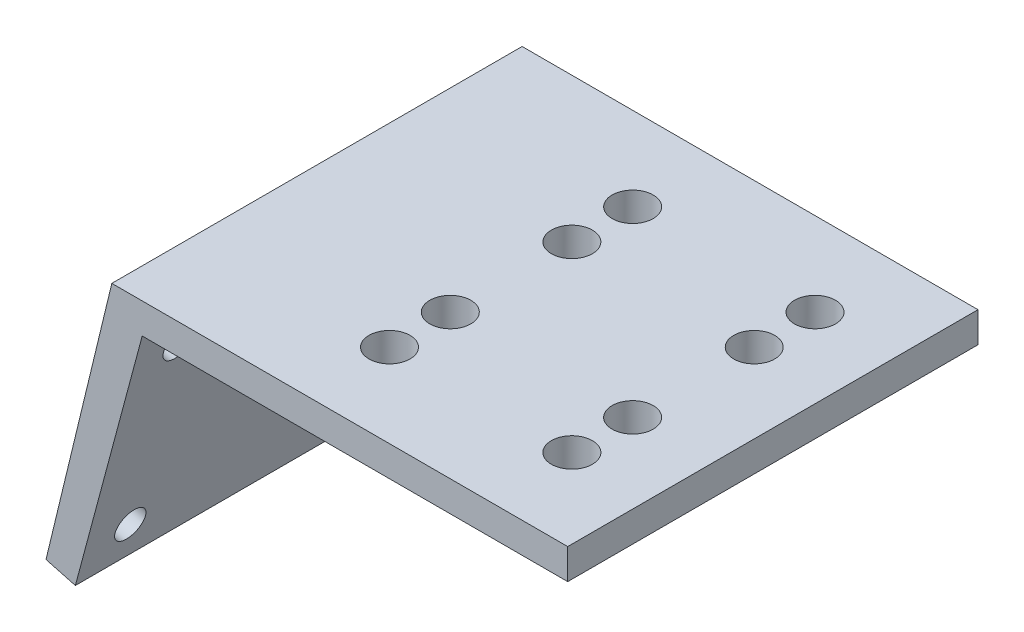
ISO-10303-21;
HEADER;
FILE_DESCRIPTION(('STEP AP214'),'2;1');
FILE_NAME('part.step','',(''),(''),'','','');
FILE_SCHEMA(('AUTOMOTIVE_DESIGN { 1 0 10303 214 1 1 1 1 }'));
ENDSEC;
DATA;
#1=APPLICATION_CONTEXT('core data for automotive mechanical design processes');
#2=APPLICATION_PROTOCOL_DEFINITION('international standard','automotive_design',2000,#1);
#3=PRODUCT_CONTEXT('',#1,'mechanical');
#4=PRODUCT('Part','Part','',(#3));
#5=PRODUCT_RELATED_PRODUCT_CATEGORY('part','',(#4));
#6=PRODUCT_DEFINITION_FORMATION('','',#4);
#7=PRODUCT_DEFINITION_CONTEXT('part definition',#1,'design');
#8=PRODUCT_DEFINITION('design','',#6,#7);
#9=PRODUCT_DEFINITION_SHAPE('','',#8);
#10=(LENGTH_UNIT() NAMED_UNIT(*) SI_UNIT(.MILLI.,.METRE.));
#11=(NAMED_UNIT(*) PLANE_ANGLE_UNIT() SI_UNIT($,.RADIAN.));
#12=(NAMED_UNIT(*) SI_UNIT($,.STERADIAN.) SOLID_ANGLE_UNIT());
#13=UNCERTAINTY_MEASURE_WITH_UNIT(LENGTH_MEASURE(1.E-05),#10,'distance_accuracy_value','');
#14=(GEOMETRIC_REPRESENTATION_CONTEXT(3) GLOBAL_UNCERTAINTY_ASSIGNED_CONTEXT((#13)) GLOBAL_UNIT_ASSIGNED_CONTEXT((#10,
#11,#12)) REPRESENTATION_CONTEXT('',''));
#15=CARTESIAN_POINT('',(0.,0.,0.));
#16=DIRECTION('',(0.,0.,1.));
#17=DIRECTION('',(1.,0.,0.));
#18=AXIS2_PLACEMENT_3D('',#15,#16,#17);
#19=CARTESIAN_POINT('',(0.,0.,27.));
#20=DIRECTION('',(-1.,0.,0.));
#21=DIRECTION('',(0.,-1.,0.));
#22=AXIS2_PLACEMENT_3D('',#19,#20,#21);
#23=PLANE('',#22);
#24=DIRECTION('',(0.,1.,0.));
#25=VECTOR('',#24,1.);
#26=CARTESIAN_POINT('',(0.,0.,0.));
#27=LINE('',#26,#25);
#28=CARTESIAN_POINT('',(0.,-2.,0.));
#29=VERTEX_POINT('',#28);
#30=CARTESIAN_POINT('',(0.,0.,0.));
#31=VERTEX_POINT('',#30);
#32=EDGE_CURVE('E121',#29,#31,#27,.T.);
#33=ORIENTED_EDGE('',*,*,#32,.T.);
#34=DIRECTION('',(0.,0.,-1.));
#35=VECTOR('',#34,1.);
#36=CARTESIAN_POINT('',(0.,0.,27.));
#37=LINE('',#36,#35);
#38=CARTESIAN_POINT('',(0.,0.,27.));
#39=VERTEX_POINT('',#38);
#40=EDGE_CURVE('E11',#39,#31,#37,.T.);
#41=ORIENTED_EDGE('',*,*,#40,.F.);
#42=DIRECTION('',(0.,1.,0.));
#43=VECTOR('',#42,1.);
#44=CARTESIAN_POINT('',(0.,0.,27.));
#45=LINE('',#44,#43);
#46=CARTESIAN_POINT('',(0.,-2.,27.));
#47=VERTEX_POINT('',#46);
#48=EDGE_CURVE('E132',#47,#39,#45,.T.);
#49=ORIENTED_EDGE('',*,*,#48,.F.);
#50=DIRECTION('',(0.,0.,-1.));
#51=VECTOR('',#50,1.);
#52=CARTESIAN_POINT('',(0.,-2.,27.));
#53=LINE('',#52,#51);
#54=EDGE_CURVE('E117',#47,#29,#53,.T.);
#55=ORIENTED_EDGE('',*,*,#54,.T.);
#56=EDGE_LOOP('',(#33,#41,#49,#55));
#57=FACE_BOUND('',#56,.T.);
#58=ADVANCED_FACE('F35',(#57),#23,.F.);
#59=CARTESIAN_POINT('',(0.,0.,27.));
#60=DIRECTION('',(0.,-1.,0.));
#61=DIRECTION('',(0.,0.,-1.));
#62=AXIS2_PLACEMENT_3D('',#59,#60,#61);
#63=PLANE('',#62);
#64=CARTESIAN_POINT('',(-5.22649731,0.,17.5));
#65=DIRECTION('',(0.,1.,0.));
#66=DIRECTION('',(0.,0.,-1.));
#67=AXIS2_PLACEMENT_3D('',#64,#65,#66);
#68=CIRCLE('',#67,1.35);
#69=CARTESIAN_POINT('',(-5.22649731,0.,16.15));
#70=VERTEX_POINT('',#69);
#71=EDGE_CURVE('E188',#70,#70,#68,.T.);
#72=ORIENTED_EDGE('',*,*,#71,.F.);
#73=EDGE_LOOP('',(#72));
#74=FACE_BOUND('',#73,.T.);
#75=CARTESIAN_POINT('',(-5.22649731,0.,9.5));
#76=DIRECTION('',(0.,1.,0.));
#77=DIRECTION('',(0.,0.,1.));
#78=AXIS2_PLACEMENT_3D('',#75,#76,#77);
#79=CIRCLE('',#78,1.35);
#80=CARTESIAN_POINT('',(-5.22649731,0.,10.85));
#81=VERTEX_POINT('',#80);
#82=EDGE_CURVE('E190',#81,#81,#79,.T.);
#83=ORIENTED_EDGE('',*,*,#82,.F.);
#84=EDGE_LOOP('',(#83));
#85=FACE_BOUND('',#84,.T.);
#86=CARTESIAN_POINT('',(-5.22649731,0.,5.5));
#87=DIRECTION('',(0.,1.,0.));
#88=DIRECTION('',(0.,0.,1.));
#89=AXIS2_PLACEMENT_3D('',#86,#87,#88);
#90=CIRCLE('',#89,1.35);
#91=CARTESIAN_POINT('',(-5.22649731,0.,6.85));
#92=VERTEX_POINT('',#91);
#93=EDGE_CURVE('E193',#92,#92,#90,.T.);
#94=ORIENTED_EDGE('',*,*,#93,.F.);
#95=EDGE_LOOP('',(#94));
#96=FACE_BOUND('',#95,.T.);
#97=CARTESIAN_POINT('',(-17.22649731,0.,9.5));
#98=DIRECTION('',(0.,1.,0.));
#99=DIRECTION('',(0.,0.,1.));
#100=AXIS2_PLACEMENT_3D('',#97,#98,#99);
#101=CIRCLE('',#100,1.35000000000001);
#102=CARTESIAN_POINT('',(-17.22649731,0.,10.85));
#103=VERTEX_POINT('',#102);
#104=EDGE_CURVE('E196',#103,#103,#101,.T.);
#105=ORIENTED_EDGE('',*,*,#104,.F.);
#106=EDGE_LOOP('',(#105));
#107=FACE_BOUND('',#106,.T.);
#108=CARTESIAN_POINT('',(-17.22649731,0.,21.5));
#109=DIRECTION('',(0.,1.,0.));
#110=DIRECTION('',(0.,0.,-1.));
#111=AXIS2_PLACEMENT_3D('',#108,#109,#110);
#112=CIRCLE('',#111,1.35000000000001);
#113=CARTESIAN_POINT('',(-17.22649731,0.,20.15));
#114=VERTEX_POINT('',#113);
#115=EDGE_CURVE('E173',#114,#114,#112,.T.);
#116=ORIENTED_EDGE('',*,*,#115,.F.);
#117=EDGE_LOOP('',(#116));
#118=FACE_BOUND('',#117,.T.);
#119=CARTESIAN_POINT('',(-17.22649731,0.,17.5));
#120=DIRECTION('',(0.,1.,0.));
#121=DIRECTION('',(0.,0.,-1.));
#122=AXIS2_PLACEMENT_3D('',#119,#120,#121);
#123=CIRCLE('',#122,1.35000000000001);
#124=CARTESIAN_POINT('',(-17.22649731,0.,16.15));
#125=VERTEX_POINT('',#124);
#126=EDGE_CURVE('E177',#125,#125,#123,.T.);
#127=ORIENTED_EDGE('',*,*,#126,.F.);
#128=EDGE_LOOP('',(#127));
#129=FACE_BOUND('',#128,.T.);
#130=CARTESIAN_POINT('',(-5.22649731,0.,21.5));
#131=DIRECTION('',(0.,1.,0.));
#132=DIRECTION('',(0.,0.,-1.));
#133=AXIS2_PLACEMENT_3D('',#130,#131,#132);
#134=CIRCLE('',#133,1.35);
#135=CARTESIAN_POINT('',(-5.22649731,0.,20.15));
#136=VERTEX_POINT('',#135);
#137=EDGE_CURVE('E182',#136,#136,#134,.T.);
#138=ORIENTED_EDGE('',*,*,#137,.F.);
#139=EDGE_LOOP('',(#138));
#140=FACE_BOUND('',#139,.T.);
#141=CARTESIAN_POINT('',(-17.22649731,0.,5.5));
#142=DIRECTION('',(0.,1.,0.));
#143=DIRECTION('',(0.,0.,1.));
#144=AXIS2_PLACEMENT_3D('',#141,#142,#143);
#145=CIRCLE('',#144,1.35000000000001);
#146=CARTESIAN_POINT('',(-17.22649731,0.,6.85));
#147=VERTEX_POINT('',#146);
#148=EDGE_CURVE('E142',#147,#147,#145,.T.);
#149=ORIENTED_EDGE('',*,*,#148,.F.);
#150=EDGE_LOOP('',(#149));
#151=FACE_BOUND('',#150,.T.);
#152=DIRECTION('',(-1.,0.,0.));
#153=VECTOR('',#152,1.);
#154=CARTESIAN_POINT('',(0.,0.,0.));
#155=LINE('',#154,#153);
#156=CARTESIAN_POINT('',(-30.,0.,0.));
#157=VERTEX_POINT('',#156);
#158=EDGE_CURVE('E124',#31,#157,#155,.T.);
#159=ORIENTED_EDGE('',*,*,#158,.T.);
#160=DIRECTION('',(0.,0.,-1.));
#161=VECTOR('',#160,1.);
#162=CARTESIAN_POINT('',(-30.,0.,27.));
#163=LINE('',#162,#161);
#164=CARTESIAN_POINT('',(-30.,0.,27.));
#165=VERTEX_POINT('',#164);
#166=EDGE_CURVE('E44',#165,#157,#163,.T.);
#167=ORIENTED_EDGE('',*,*,#166,.F.);
#168=DIRECTION('',(-1.,0.,0.));
#169=VECTOR('',#168,1.);
#170=CARTESIAN_POINT('',(0.,0.,27.));
#171=LINE('',#170,#169);
#172=EDGE_CURVE('E90',#39,#165,#171,.T.);
#173=ORIENTED_EDGE('',*,*,#172,.F.);
#174=ORIENTED_EDGE('',*,*,#40,.T.);
#175=EDGE_LOOP('',(#159,#167,#173,#174));
#176=FACE_BOUND('',#175,.T.);
#177=ADVANCED_FACE('F206',(#74,#85,#96,#107,#118,#129,#140,#151,#176),#63,.F.);
#178=CARTESIAN_POINT('',(-34.3317754193209,-17.9031009567091,27.));
#179=DIRECTION('',(0.971954058360405,-0.235170806939847,0.));
#180=DIRECTION('',(0.235170806939847,0.971954058360405,0.));
#181=AXIS2_PLACEMENT_3D('',#178,#179,#180);
#182=PLANE('',#181);
#183=CARTESIAN_POINT('',(-30.8936490663714,-3.69342542176954,24.));
#184=DIRECTION('',(-0.971954058360405,0.235170806939847,0.));
#185=DIRECTION('',(0.235170806939847,0.971954058360405,0.));
#186=AXIS2_PLACEMENT_3D('',#183,#184,#185);
#187=CIRCLE('',#186,0.999999999999998);
#188=CARTESIAN_POINT('',(-30.6584782594316,-2.72147136340913,24.));
#189=VERTEX_POINT('',#188);
#190=EDGE_CURVE('E439',#189,#189,#187,.T.);
#191=ORIENTED_EDGE('',*,*,#190,.F.);
#192=EDGE_LOOP('',(#191));
#193=FACE_BOUND('',#192,.T.);
#194=CARTESIAN_POINT('',(-33.7862499917315,-15.6484603396025,24.));
#195=DIRECTION('',(-0.971954058360405,0.235170806939847,0.));
#196=DIRECTION('',(0.235170806939847,0.971954058360405,0.));
#197=AXIS2_PLACEMENT_3D('',#194,#195,#196);
#198=CIRCLE('',#197,0.999999999999994);
#199=CARTESIAN_POINT('',(-33.5510791847917,-14.6765062812421,24.));
#200=VERTEX_POINT('',#199);
#201=EDGE_CURVE('E440',#200,#200,#198,.T.);
#202=ORIENTED_EDGE('',*,*,#201,.F.);
#203=EDGE_LOOP('',(#202));
#204=FACE_BOUND('',#203,.T.);
#205=CARTESIAN_POINT('',(-33.7862499917315,-15.6484603396025,3.));
#206=DIRECTION('',(-0.971954058360405,0.235170806939847,0.));
#207=DIRECTION('',(-0.235170806939847,-0.971954058360405,0.));
#208=AXIS2_PLACEMENT_3D('',#205,#206,#207);
#209=CIRCLE('',#208,0.999999999999999);
#210=CARTESIAN_POINT('',(-34.0214207986714,-16.6204143979629,3.));
#211=VERTEX_POINT('',#210);
#212=EDGE_CURVE('E442',#211,#211,#209,.T.);
#213=ORIENTED_EDGE('',*,*,#212,.F.);
#214=EDGE_LOOP('',(#213));
#215=FACE_BOUND('',#214,.T.);
#216=CARTESIAN_POINT('',(-30.8936490663714,-3.69342542176954,3.));
#217=DIRECTION('',(-0.971954058360405,0.235170806939847,0.));
#218=DIRECTION('',(-0.235170806939847,-0.971954058360405,0.));
#219=AXIS2_PLACEMENT_3D('',#216,#217,#218);
#220=CIRCLE('',#219,1.);
#221=CARTESIAN_POINT('',(-31.1288198733113,-4.66537948012994,3.));
#222=VERTEX_POINT('',#221);
#223=EDGE_CURVE('E166',#222,#222,#220,.T.);
#224=ORIENTED_EDGE('',*,*,#223,.F.);
#225=EDGE_LOOP('',(#224));
#226=FACE_BOUND('',#225,.T.);
#227=DIRECTION('',(-0.235170806939847,-0.971954058360405,0.));
#228=VECTOR('',#227,1.);
#229=CARTESIAN_POINT('',(-34.3317754193209,-17.9031009567091,0.));
#230=LINE('',#229,#228);
#231=CARTESIAN_POINT('',(-34.3317754193209,-17.9031009567091,0.));
#232=VERTEX_POINT('',#231);
#233=EDGE_CURVE('E127',#157,#232,#230,.T.);
#234=ORIENTED_EDGE('',*,*,#233,.T.);
#235=DIRECTION('',(0.,0.,-1.));
#236=VECTOR('',#235,1.);
#237=CARTESIAN_POINT('',(-34.3317754193209,-17.9031009567091,27.));
#238=LINE('',#237,#236);
#239=CARTESIAN_POINT('',(-34.3317754193209,-17.9031009567091,27.));
#240=VERTEX_POINT('',#239);
#241=EDGE_CURVE('E112',#240,#232,#238,.T.);
#242=ORIENTED_EDGE('',*,*,#241,.F.);
#243=DIRECTION('',(-0.235170806939847,-0.971954058360405,0.));
#244=VECTOR('',#243,1.);
#245=CARTESIAN_POINT('',(-34.3317754193209,-17.9031009567091,27.));
#246=LINE('',#245,#244);
#247=EDGE_CURVE('E103',#165,#240,#246,.T.);
#248=ORIENTED_EDGE('',*,*,#247,.F.);
#249=ORIENTED_EDGE('',*,*,#166,.T.);
#250=EDGE_LOOP('',(#234,#242,#248,#249));
#251=FACE_BOUND('',#250,.T.);
#252=ADVANCED_FACE('F209',(#193,#204,#215,#226,#251),#182,.F.);
#253=CARTESIAN_POINT('',(-32.3999237667428,-18.4207390469142,27.));
#254=DIRECTION('',(0.258819045102516,0.96592582628907,0.));
#255=DIRECTION('',(-0.96592582628907,0.258819045102516,0.));
#256=AXIS2_PLACEMENT_3D('',#253,#254,#255);
#257=PLANE('',#256);
#258=DIRECTION('',(0.96592582628907,-0.258819045102516,0.));
#259=VECTOR('',#258,1.);
#260=CARTESIAN_POINT('',(-32.3999237667428,-18.4207390469142,0.));
#261=LINE('',#260,#259);
#262=CARTESIAN_POINT('',(-32.3999237667428,-18.4207390469142,0.));
#263=VERTEX_POINT('',#262);
#264=EDGE_CURVE('E111',#232,#263,#261,.T.);
#265=ORIENTED_EDGE('',*,*,#264,.T.);
#266=DIRECTION('',(0.,0.,-1.));
#267=VECTOR('',#266,1.);
#268=CARTESIAN_POINT('',(-32.3999237667428,-18.4207390469142,27.));
#269=LINE('',#268,#267);
#270=CARTESIAN_POINT('',(-32.3999237667428,-18.4207390469142,27.));
#271=VERTEX_POINT('',#270);
#272=EDGE_CURVE('E108',#271,#263,#269,.T.);
#273=ORIENTED_EDGE('',*,*,#272,.F.);
#274=DIRECTION('',(0.96592582628907,-0.258819045102516,0.));
#275=VECTOR('',#274,1.);
#276=CARTESIAN_POINT('',(-32.3999237667428,-18.4207390469142,27.));
#277=LINE('',#276,#275);
#278=EDGE_CURVE('E97',#240,#271,#277,.T.);
#279=ORIENTED_EDGE('',*,*,#278,.F.);
#280=ORIENTED_EDGE('',*,*,#241,.T.);
#281=EDGE_LOOP('',(#265,#273,#279,#280));
#282=FACE_BOUND('',#281,.T.);
#283=ADVANCED_FACE('F109',(#282),#257,.F.);
#284=CARTESIAN_POINT('',(-28.,-2.,27.));
#285=DIRECTION('',(-0.965925826289069,0.258819045102518,0.));
#286=DIRECTION('',(-0.258819045102518,-0.965925826289069,0.));
#287=AXIS2_PLACEMENT_3D('',#284,#285,#286);
#288=PLANE('',#287);
#289=CARTESIAN_POINT('',(-28.6023046561563,-4.24783157841072,24.));
#290=DIRECTION('',(-0.965925826289069,0.258819045102518,0.));
#291=DIRECTION('',(-0.258819045102518,-0.965925826289069,0.));
#292=AXIS2_PLACEMENT_3D('',#289,#290,#291);
#293=ELLIPSE('',#292,1.00029787807998,0.999999999999998);
#294=CARTESIAN_POINT('',(-28.8612007977791,-5.21404513283032,24.));
#295=VERTEX_POINT('',#294);
#296=EDGE_CURVE('E38',#295,#295,#293,.T.);
#297=ORIENTED_EDGE('',*,*,#296,.T.);
#298=EDGE_LOOP('',(#297));
#299=FACE_BOUND('',#298,.T.);
#300=CARTESIAN_POINT('',(-31.786727198116,-16.1322582977719,24.));
#301=DIRECTION('',(-0.965925826289069,0.258819045102518,0.));
#302=DIRECTION('',(-0.258819045102518,-0.965925826289069,0.));
#303=AXIS2_PLACEMENT_3D('',#300,#301,#302);
#304=ELLIPSE('',#303,1.00029787807997,0.999999999999994);
#305=CARTESIAN_POINT('',(-32.0456233397387,-17.0984718521915,24.));
#306=VERTEX_POINT('',#305);
#307=EDGE_CURVE('E168',#306,#306,#304,.T.);
#308=ORIENTED_EDGE('',*,*,#307,.T.);
#309=EDGE_LOOP('',(#308));
#310=FACE_BOUND('',#309,.T.);
#311=CARTESIAN_POINT('',(-31.786727198116,-16.1322582977719,3.));
#312=DIRECTION('',(-0.965925826289069,0.258819045102518,0.));
#313=DIRECTION('',(-0.258819045102518,-0.965925826289069,0.));
#314=AXIS2_PLACEMENT_3D('',#311,#312,#313);
#315=ELLIPSE('',#314,1.00029787807998,0.999999999999999);
#316=CARTESIAN_POINT('',(-32.0456233397387,-17.0984718521915,3.));
#317=VERTEX_POINT('',#316);
#318=EDGE_CURVE('E165',#317,#317,#315,.T.);
#319=ORIENTED_EDGE('',*,*,#318,.T.);
#320=EDGE_LOOP('',(#319));
#321=FACE_BOUND('',#320,.T.);
#322=CARTESIAN_POINT('',(-28.6023046561563,-4.24783157841072,3.));
#323=DIRECTION('',(-0.965925826289069,0.258819045102518,0.));
#324=DIRECTION('',(-0.258819045102518,-0.965925826289069,0.));
#325=AXIS2_PLACEMENT_3D('',#322,#323,#324);
#326=ELLIPSE('',#325,1.00029787807998,1.);
#327=CARTESIAN_POINT('',(-28.8612007977791,-5.21404513283033,3.));
#328=VERTEX_POINT('',#327);
#329=EDGE_CURVE('E162',#328,#328,#326,.T.);
#330=ORIENTED_EDGE('',*,*,#329,.T.);
#331=EDGE_LOOP('',(#330));
#332=FACE_BOUND('',#331,.T.);
#333=DIRECTION('',(0.258819045102518,0.965925826289069,0.));
#334=VECTOR('',#333,1.);
#335=CARTESIAN_POINT('',(-28.,-2.,0.));
#336=LINE('',#335,#334);
#337=CARTESIAN_POINT('',(-28.,-2.,0.));
#338=VERTEX_POINT('',#337);
#339=EDGE_CURVE('E76',#263,#338,#336,.T.);
#340=ORIENTED_EDGE('',*,*,#339,.T.);
#341=DIRECTION('',(0.,0.,-1.));
#342=VECTOR('',#341,1.);
#343=CARTESIAN_POINT('',(-28.,-2.,27.));
#344=LINE('',#343,#342);
#345=CARTESIAN_POINT('',(-28.,-2.,27.));
#346=VERTEX_POINT('',#345);
#347=EDGE_CURVE('E113',#346,#338,#344,.T.);
#348=ORIENTED_EDGE('',*,*,#347,.F.);
#349=DIRECTION('',(0.258819045102518,0.965925826289069,0.));
#350=VECTOR('',#349,1.);
#351=CARTESIAN_POINT('',(-28.,-2.,27.));
#352=LINE('',#351,#350);
#353=EDGE_CURVE('E101',#271,#346,#352,.T.);
#354=ORIENTED_EDGE('',*,*,#353,.F.);
#355=ORIENTED_EDGE('',*,*,#272,.T.);
#356=EDGE_LOOP('',(#340,#348,#354,#355));
#357=FACE_BOUND('',#356,.T.);
#358=ADVANCED_FACE('F115',(#299,#310,#321,#332,#357),#288,.F.);
#359=CARTESIAN_POINT('',(0.,-2.,27.));
#360=DIRECTION('',(0.,1.,0.));
#361=DIRECTION('',(-1.,0.,0.));
#362=AXIS2_PLACEMENT_3D('',#359,#360,#361);
#363=PLANE('',#362);
#364=CARTESIAN_POINT('',(-5.22649731,-2.,17.5));
#365=DIRECTION('',(0.,1.,0.));
#366=DIRECTION('',(-1.,0.,0.));
#367=AXIS2_PLACEMENT_3D('',#364,#365,#366);
#368=CIRCLE('',#367,1.35);
#369=CARTESIAN_POINT('',(-6.57649731,-2.,17.5));
#370=VERTEX_POINT('',#369);
#371=EDGE_CURVE('E125',#370,#370,#368,.T.);
#372=ORIENTED_EDGE('',*,*,#371,.T.);
#373=EDGE_LOOP('',(#372));
#374=FACE_BOUND('',#373,.T.);
#375=CARTESIAN_POINT('',(-5.22649731,-2.,9.5));
#376=DIRECTION('',(0.,1.,0.));
#377=DIRECTION('',(-1.,0.,0.));
#378=AXIS2_PLACEMENT_3D('',#375,#376,#377);
#379=CIRCLE('',#378,1.35);
#380=CARTESIAN_POINT('',(-6.57649731,-2.,9.5));
#381=VERTEX_POINT('',#380);
#382=EDGE_CURVE('E157',#381,#381,#379,.T.);
#383=ORIENTED_EDGE('',*,*,#382,.T.);
#384=EDGE_LOOP('',(#383));
#385=FACE_BOUND('',#384,.T.);
#386=CARTESIAN_POINT('',(-5.22649731,-2.,5.5));
#387=DIRECTION('',(0.,1.,0.));
#388=DIRECTION('',(-1.,0.,0.));
#389=AXIS2_PLACEMENT_3D('',#386,#387,#388);
#390=CIRCLE('',#389,1.35);
#391=CARTESIAN_POINT('',(-6.57649731,-2.,5.5));
#392=VERTEX_POINT('',#391);
#393=EDGE_CURVE('E154',#392,#392,#390,.T.);
#394=ORIENTED_EDGE('',*,*,#393,.T.);
#395=EDGE_LOOP('',(#394));
#396=FACE_BOUND('',#395,.T.);
#397=CARTESIAN_POINT('',(-17.22649731,-2.,9.5));
#398=DIRECTION('',(0.,1.,0.));
#399=DIRECTION('',(-1.,0.,0.));
#400=AXIS2_PLACEMENT_3D('',#397,#398,#399);
#401=CIRCLE('',#400,1.35000000000001);
#402=CARTESIAN_POINT('',(-18.57649731,-2.,9.5));
#403=VERTEX_POINT('',#402);
#404=EDGE_CURVE('E151',#403,#403,#401,.T.);
#405=ORIENTED_EDGE('',*,*,#404,.T.);
#406=EDGE_LOOP('',(#405));
#407=FACE_BOUND('',#406,.T.);
#408=CARTESIAN_POINT('',(-17.22649731,-2.,21.5));
#409=DIRECTION('',(0.,1.,0.));
#410=DIRECTION('',(-1.,0.,0.));
#411=AXIS2_PLACEMENT_3D('',#408,#409,#410);
#412=CIRCLE('',#411,1.35000000000001);
#413=CARTESIAN_POINT('',(-18.57649731,-2.,21.5));
#414=VERTEX_POINT('',#413);
#415=EDGE_CURVE('E148',#414,#414,#412,.T.);
#416=ORIENTED_EDGE('',*,*,#415,.T.);
#417=EDGE_LOOP('',(#416));
#418=FACE_BOUND('',#417,.T.);
#419=CARTESIAN_POINT('',(-17.22649731,-2.,17.5));
#420=DIRECTION('',(0.,1.,0.));
#421=DIRECTION('',(-1.,0.,0.));
#422=AXIS2_PLACEMENT_3D('',#419,#420,#421);
#423=CIRCLE('',#422,1.35000000000001);
#424=CARTESIAN_POINT('',(-18.57649731,-2.,17.5));
#425=VERTEX_POINT('',#424);
#426=EDGE_CURVE('E145',#425,#425,#423,.T.);
#427=ORIENTED_EDGE('',*,*,#426,.T.);
#428=EDGE_LOOP('',(#427));
#429=FACE_BOUND('',#428,.T.);
#430=CARTESIAN_POINT('',(-5.22649731,-2.,21.5));
#431=DIRECTION('',(0.,1.,0.));
#432=DIRECTION('',(-1.,0.,0.));
#433=AXIS2_PLACEMENT_3D('',#430,#431,#432);
#434=CIRCLE('',#433,1.35);
#435=CARTESIAN_POINT('',(-6.57649731,-2.,21.5));
#436=VERTEX_POINT('',#435);
#437=EDGE_CURVE('E141',#436,#436,#434,.T.);
#438=ORIENTED_EDGE('',*,*,#437,.T.);
#439=EDGE_LOOP('',(#438));
#440=FACE_BOUND('',#439,.T.);
#441=CARTESIAN_POINT('',(-17.22649731,-2.,5.5));
#442=DIRECTION('',(0.,1.,0.));
#443=DIRECTION('',(-1.,0.,0.));
#444=AXIS2_PLACEMENT_3D('',#441,#442,#443);
#445=CIRCLE('',#444,1.35000000000001);
#446=CARTESIAN_POINT('',(-18.57649731,-2.,5.5));
#447=VERTEX_POINT('',#446);
#448=EDGE_CURVE('E138',#447,#447,#445,.T.);
#449=ORIENTED_EDGE('',*,*,#448,.T.);
#450=EDGE_LOOP('',(#449));
#451=FACE_BOUND('',#450,.T.);
#452=DIRECTION('',(1.,0.,0.));
#453=VECTOR('',#452,1.);
#454=CARTESIAN_POINT('',(0.,-2.,0.));
#455=LINE('',#454,#453);
#456=EDGE_CURVE('E82',#338,#29,#455,.T.);
#457=ORIENTED_EDGE('',*,*,#456,.T.);
#458=ORIENTED_EDGE('',*,*,#54,.F.);
#459=DIRECTION('',(1.,0.,0.));
#460=VECTOR('',#459,1.);
#461=CARTESIAN_POINT('',(0.,-2.,27.));
#462=LINE('',#461,#460);
#463=EDGE_CURVE('E53',#346,#47,#462,.T.);
#464=ORIENTED_EDGE('',*,*,#463,.F.);
#465=ORIENTED_EDGE('',*,*,#347,.T.);
#466=EDGE_LOOP('',(#457,#458,#464,#465));
#467=FACE_BOUND('',#466,.T.);
#468=ADVANCED_FACE('F214',(#374,#385,#396,#407,#418,#429,#440,#451,#467),#363,.F.);
#469=CARTESIAN_POINT('',(0.,0.,27.));
#470=DIRECTION('',(0.,0.,-1.));
#471=DIRECTION('',(-1.,0.,0.));
#472=AXIS2_PLACEMENT_3D('',#469,#470,#471);
#473=PLANE('',#472);
#474=ORIENTED_EDGE('',*,*,#48,.T.);
#475=ORIENTED_EDGE('',*,*,#172,.T.);
#476=ORIENTED_EDGE('',*,*,#247,.T.);
#477=ORIENTED_EDGE('',*,*,#278,.T.);
#478=ORIENTED_EDGE('',*,*,#353,.T.);
#479=ORIENTED_EDGE('',*,*,#463,.T.);
#480=EDGE_LOOP('',(#474,#475,#476,#477,#478,#479));
#481=FACE_BOUND('',#480,.T.);
#482=ADVANCED_FACE('F99',(#481),#473,.F.);
#483=CARTESIAN_POINT('',(0.,0.,0.));
#484=DIRECTION('',(0.,0.,-1.));
#485=DIRECTION('',(-1.,0.,0.));
#486=AXIS2_PLACEMENT_3D('',#483,#484,#485);
#487=PLANE('',#486);
#488=ORIENTED_EDGE('',*,*,#32,.F.);
#489=ORIENTED_EDGE('',*,*,#456,.F.);
#490=ORIENTED_EDGE('',*,*,#339,.F.);
#491=ORIENTED_EDGE('',*,*,#264,.F.);
#492=ORIENTED_EDGE('',*,*,#233,.F.);
#493=ORIENTED_EDGE('',*,*,#158,.F.);
#494=EDGE_LOOP('',(#488,#489,#490,#491,#492,#493));
#495=FACE_BOUND('',#494,.T.);
#496=ADVANCED_FACE('F212',(#495),#487,.T.);
#497=CARTESIAN_POINT('',(-17.22649731,-20.,5.5));
#498=DIRECTION('',(0.,1.,0.));
#499=DIRECTION('',(0.,0.,1.));
#500=AXIS2_PLACEMENT_3D('',#497,#498,#499);
#501=CYLINDRICAL_SURFACE('',#500,1.35000000000001);
#502=ORIENTED_EDGE('',*,*,#148,.T.);
#503=EDGE_LOOP('',(#502));
#504=FACE_BOUND('',#503,.T.);
#505=ORIENTED_EDGE('',*,*,#448,.F.);
#506=EDGE_LOOP('',(#505));
#507=FACE_BOUND('',#506,.T.);
#508=ADVANCED_FACE('F311',(#504,#507),#501,.F.);
#509=CARTESIAN_POINT('',(-5.22649731,-20.,21.5));
#510=DIRECTION('',(0.,1.,0.));
#511=DIRECTION('',(0.,0.,1.));
#512=AXIS2_PLACEMENT_3D('',#509,#510,#511);
#513=CYLINDRICAL_SURFACE('',#512,1.35);
#514=ORIENTED_EDGE('',*,*,#137,.T.);
#515=EDGE_LOOP('',(#514));
#516=FACE_BOUND('',#515,.T.);
#517=ORIENTED_EDGE('',*,*,#437,.F.);
#518=EDGE_LOOP('',(#517));
#519=FACE_BOUND('',#518,.T.);
#520=ADVANCED_FACE('F308',(#516,#519),#513,.F.);
#521=CARTESIAN_POINT('',(-17.22649731,-20.,17.5));
#522=DIRECTION('',(0.,1.,0.));
#523=DIRECTION('',(0.,0.,1.));
#524=AXIS2_PLACEMENT_3D('',#521,#522,#523);
#525=CYLINDRICAL_SURFACE('',#524,1.35000000000001);
#526=ORIENTED_EDGE('',*,*,#126,.T.);
#527=EDGE_LOOP('',(#526));
#528=FACE_BOUND('',#527,.T.);
#529=ORIENTED_EDGE('',*,*,#426,.F.);
#530=EDGE_LOOP('',(#529));
#531=FACE_BOUND('',#530,.T.);
#532=ADVANCED_FACE('F307',(#528,#531),#525,.F.);
#533=CARTESIAN_POINT('',(-17.22649731,-20.,21.5));
#534=DIRECTION('',(0.,1.,0.));
#535=DIRECTION('',(0.,0.,1.));
#536=AXIS2_PLACEMENT_3D('',#533,#534,#535);
#537=CYLINDRICAL_SURFACE('',#536,1.35000000000001);
#538=ORIENTED_EDGE('',*,*,#115,.T.);
#539=EDGE_LOOP('',(#538));
#540=FACE_BOUND('',#539,.T.);
#541=ORIENTED_EDGE('',*,*,#415,.F.);
#542=EDGE_LOOP('',(#541));
#543=FACE_BOUND('',#542,.T.);
#544=ADVANCED_FACE('F303',(#540,#543),#537,.F.);
#545=CARTESIAN_POINT('',(-17.22649731,-20.,9.5));
#546=DIRECTION('',(0.,1.,0.));
#547=DIRECTION('',(0.,0.,1.));
#548=AXIS2_PLACEMENT_3D('',#545,#546,#547);
#549=CYLINDRICAL_SURFACE('',#548,1.35000000000001);
#550=ORIENTED_EDGE('',*,*,#104,.T.);
#551=EDGE_LOOP('',(#550));
#552=FACE_BOUND('',#551,.T.);
#553=ORIENTED_EDGE('',*,*,#404,.F.);
#554=EDGE_LOOP('',(#553));
#555=FACE_BOUND('',#554,.T.);
#556=ADVANCED_FACE('F306',(#552,#555),#549,.F.);
#557=CARTESIAN_POINT('',(-5.22649731,-20.,5.5));
#558=DIRECTION('',(0.,1.,0.));
#559=DIRECTION('',(0.,0.,1.));
#560=AXIS2_PLACEMENT_3D('',#557,#558,#559);
#561=CYLINDRICAL_SURFACE('',#560,1.35);
#562=ORIENTED_EDGE('',*,*,#93,.T.);
#563=EDGE_LOOP('',(#562));
#564=FACE_BOUND('',#563,.T.);
#565=ORIENTED_EDGE('',*,*,#393,.F.);
#566=EDGE_LOOP('',(#565));
#567=FACE_BOUND('',#566,.T.);
#568=ADVANCED_FACE('F319',(#564,#567),#561,.F.);
#569=CARTESIAN_POINT('',(-5.22649731,-20.,9.5));
#570=DIRECTION('',(0.,1.,0.));
#571=DIRECTION('',(0.,0.,1.));
#572=AXIS2_PLACEMENT_3D('',#569,#570,#571);
#573=CYLINDRICAL_SURFACE('',#572,1.35);
#574=ORIENTED_EDGE('',*,*,#82,.T.);
#575=EDGE_LOOP('',(#574));
#576=FACE_BOUND('',#575,.T.);
#577=ORIENTED_EDGE('',*,*,#382,.F.);
#578=EDGE_LOOP('',(#577));
#579=FACE_BOUND('',#578,.T.);
#580=ADVANCED_FACE('F316',(#576,#579),#573,.F.);
#581=CARTESIAN_POINT('',(-5.22649731,-20.,17.5));
#582=DIRECTION('',(0.,1.,0.));
#583=DIRECTION('',(0.,0.,1.));
#584=AXIS2_PLACEMENT_3D('',#581,#582,#583);
#585=CYLINDRICAL_SURFACE('',#584,1.35);
#586=ORIENTED_EDGE('',*,*,#71,.T.);
#587=EDGE_LOOP('',(#586));
#588=FACE_BOUND('',#587,.T.);
#589=ORIENTED_EDGE('',*,*,#371,.F.);
#590=EDGE_LOOP('',(#589));
#591=FACE_BOUND('',#590,.T.);
#592=ADVANCED_FACE('F264',(#588,#591),#585,.F.);
#593=CARTESIAN_POINT('',(-11.4545678991633,-8.39684156056647,3.));
#594=DIRECTION('',(-0.971954058360405,0.235170806939847,0.));
#595=DIRECTION('',(-0.235170806939847,-0.971954058360405,0.));
#596=AXIS2_PLACEMENT_3D('',#593,#594,#595);
#597=CYLINDRICAL_SURFACE('',#596,1.);
#598=ORIENTED_EDGE('',*,*,#223,.T.);
#599=EDGE_LOOP('',(#598));
#600=FACE_BOUND('',#599,.T.);
#601=ORIENTED_EDGE('',*,*,#329,.F.);
#602=EDGE_LOOP('',(#601));
#603=FACE_BOUND('',#602,.T.);
#604=ADVANCED_FACE('F258',(#600,#603),#597,.F.);
#605=CARTESIAN_POINT('',(-14.3471688245234,-20.3518764783995,3.));
#606=DIRECTION('',(-0.971954058360405,0.235170806939847,0.));
#607=DIRECTION('',(-0.235170806939847,-0.971954058360405,0.));
#608=AXIS2_PLACEMENT_3D('',#605,#606,#607);
#609=CYLINDRICAL_SURFACE('',#608,0.999999999999999);
#610=ORIENTED_EDGE('',*,*,#212,.T.);
#611=EDGE_LOOP('',(#610));
#612=FACE_BOUND('',#611,.T.);
#613=ORIENTED_EDGE('',*,*,#318,.F.);
#614=EDGE_LOOP('',(#613));
#615=FACE_BOUND('',#614,.T.);
#616=ADVANCED_FACE('F263',(#612,#615),#609,.F.);
#617=CARTESIAN_POINT('',(-14.3471688245234,-20.3518764783995,24.));
#618=DIRECTION('',(-0.971954058360405,0.235170806939847,0.));
#619=DIRECTION('',(-0.235170806939847,-0.971954058360405,0.));
#620=AXIS2_PLACEMENT_3D('',#617,#618,#619);
#621=CYLINDRICAL_SURFACE('',#620,0.999999999999994);
#622=ORIENTED_EDGE('',*,*,#201,.T.);
#623=EDGE_LOOP('',(#622));
#624=FACE_BOUND('',#623,.T.);
#625=ORIENTED_EDGE('',*,*,#307,.F.);
#626=EDGE_LOOP('',(#625));
#627=FACE_BOUND('',#626,.T.);
#628=ADVANCED_FACE('F276',(#624,#627),#621,.F.);
#629=CARTESIAN_POINT('',(-11.4545678991633,-8.39684156056647,24.));
#630=DIRECTION('',(-0.971954058360405,0.235170806939847,0.));
#631=DIRECTION('',(-0.235170806939847,-0.971954058360405,0.));
#632=AXIS2_PLACEMENT_3D('',#629,#630,#631);
#633=CYLINDRICAL_SURFACE('',#632,0.999999999999998);
#634=ORIENTED_EDGE('',*,*,#190,.T.);
#635=EDGE_LOOP('',(#634));
#636=FACE_BOUND('',#635,.T.);
#637=ORIENTED_EDGE('',*,*,#296,.F.);
#638=EDGE_LOOP('',(#637));
#639=FACE_BOUND('',#638,.T.);
#640=ADVANCED_FACE('F286',(#636,#639),#633,.F.);
#641=CLOSED_SHELL('',(#58,#177,#252,#283,#358,#468,#482,#496,#508,#520,#532,#544,#556,#568,#580,
#592,#604,#616,#628,#640));
#642=MANIFOLD_SOLID_BREP('B2',#641);
#643=ADVANCED_BREP_SHAPE_REPRESENTATION('',(#18,#642),#14);
#644=SHAPE_DEFINITION_REPRESENTATION(#9,#643);
ENDSEC;
END-ISO-10303-21;
